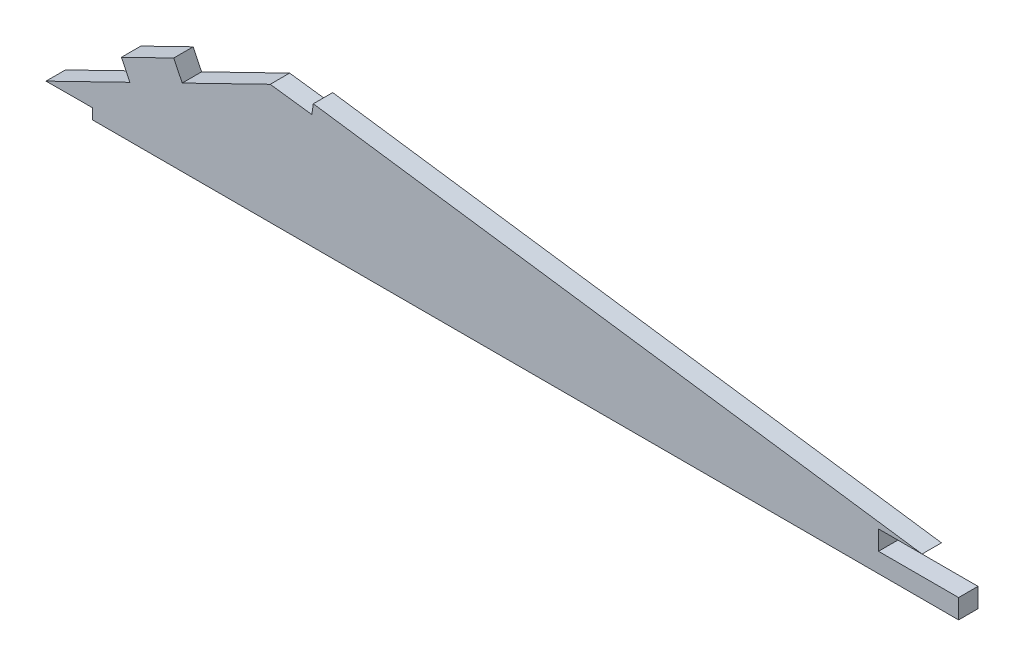
ISO-10303-21;
HEADER;
FILE_DESCRIPTION(('STEP AP214'),'2;1');
FILE_NAME('part.step','',(''),(''),'','','');
FILE_SCHEMA(('AUTOMOTIVE_DESIGN { 1 0 10303 214 1 1 1 1 }'));
ENDSEC;
DATA;
#1=APPLICATION_CONTEXT('core data for automotive mechanical design processes');
#2=APPLICATION_PROTOCOL_DEFINITION('international standard','automotive_design',2000,#1);
#3=PRODUCT_CONTEXT('',#1,'mechanical');
#4=PRODUCT('Part','Part','',(#3));
#5=PRODUCT_RELATED_PRODUCT_CATEGORY('part','',(#4));
#6=PRODUCT_DEFINITION_FORMATION('','',#4);
#7=PRODUCT_DEFINITION_CONTEXT('part definition',#1,'design');
#8=PRODUCT_DEFINITION('design','',#6,#7);
#9=PRODUCT_DEFINITION_SHAPE('','',#8);
#10=(LENGTH_UNIT() NAMED_UNIT(*) SI_UNIT(.MILLI.,.METRE.));
#11=(NAMED_UNIT(*) PLANE_ANGLE_UNIT() SI_UNIT($,.RADIAN.));
#12=(NAMED_UNIT(*) SI_UNIT($,.STERADIAN.) SOLID_ANGLE_UNIT());
#13=UNCERTAINTY_MEASURE_WITH_UNIT(LENGTH_MEASURE(1.E-05),#10,'distance_accuracy_value','');
#14=(GEOMETRIC_REPRESENTATION_CONTEXT(3) GLOBAL_UNCERTAINTY_ASSIGNED_CONTEXT((#13)) GLOBAL_UNIT_ASSIGNED_CONTEXT((#10,
#11,#12)) REPRESENTATION_CONTEXT('',''));
#15=CARTESIAN_POINT('',(0.,0.,0.));
#16=DIRECTION('',(0.,0.,1.));
#17=DIRECTION('',(1.,0.,0.));
#18=AXIS2_PLACEMENT_3D('',#15,#16,#17);
#19=CARTESIAN_POINT('',(10.8739383878739,9.30096898102377,2.));
#20=DIRECTION('',(0.438371146789072,-0.89879404629917,0.));
#21=DIRECTION('',(0.89879404629917,0.438371146789072,0.));
#22=AXIS2_PLACEMENT_3D('',#19,#20,#21);
#23=PLANE('',#22);
#24=DIRECTION('',(-0.898794046299169,-0.438371146789072,0.));
#25=VECTOR('',#24,1.);
#26=CARTESIAN_POINT('',(10.8739383878739,9.30096898102377,0.));
#27=LINE('',#26,#25);
#28=CARTESIAN_POINT('',(10.8739383878739,9.30096898102377,0.));
#29=VERTEX_POINT('',#28);
#30=CARTESIAN_POINT('',(2.2239444862891,5.08208506432496,0.));
#31=VERTEX_POINT('',#30);
#32=EDGE_CURVE('E172',#29,#31,#27,.T.);
#33=ORIENTED_EDGE('',*,*,#32,.T.);
#34=DIRECTION('',(0.,0.,-1.));
#35=VECTOR('',#34,1.);
#36=CARTESIAN_POINT('',(2.2239444862891,5.08208506432496,2.));
#37=LINE('',#36,#35);
#38=CARTESIAN_POINT('',(2.2239444862891,5.08208506432496,2.));
#39=VERTEX_POINT('',#38);
#40=EDGE_CURVE('E11',#39,#31,#37,.T.);
#41=ORIENTED_EDGE('',*,*,#40,.F.);
#42=DIRECTION('',(-0.898794046299169,-0.438371146789072,0.));
#43=VECTOR('',#42,1.);
#44=CARTESIAN_POINT('',(10.8739383878739,9.30096898102377,2.));
#45=LINE('',#44,#43);
#46=CARTESIAN_POINT('',(10.8739383878739,9.30096898102377,2.));
#47=VERTEX_POINT('',#46);
#48=EDGE_CURVE('E200',#47,#39,#45,.T.);
#49=ORIENTED_EDGE('',*,*,#48,.F.);
#50=DIRECTION('',(0.,0.,-1.));
#51=VECTOR('',#50,1.);
#52=CARTESIAN_POINT('',(10.8739383878739,9.30096898102377,2.));
#53=LINE('',#52,#51);
#54=EDGE_CURVE('E168',#47,#29,#53,.T.);
#55=ORIENTED_EDGE('',*,*,#54,.T.);
#56=EDGE_LOOP('',(#33,#41,#49,#55));
#57=FACE_BOUND('',#56,.T.);
#58=ADVANCED_FACE('F34',(#57),#23,.F.);
#59=CARTESIAN_POINT('',(7.00541028453807,5.10064133549443,2.));
#60=DIRECTION('',(-0.00388084579378902,0.999992469489608,0.));
#61=DIRECTION('',(-0.999992469489608,-0.00388084579378902,0.));
#62=AXIS2_PLACEMENT_3D('',#59,#60,#61);
#63=PLANE('',#62);
#64=DIRECTION('',(0.999992469489608,0.00388084579378902,0.));
#65=VECTOR('',#64,1.);
#66=CARTESIAN_POINT('',(7.00541028453807,5.10064133549443,0.));
#67=LINE('',#66,#65);
#68=CARTESIAN_POINT('',(7.00541028453807,5.10064133549443,0.));
#69=VERTEX_POINT('',#68);
#70=EDGE_CURVE('E175',#31,#69,#67,.T.);
#71=ORIENTED_EDGE('',*,*,#70,.T.);
#72=DIRECTION('',(0.,0.,-1.));
#73=VECTOR('',#72,1.);
#74=CARTESIAN_POINT('',(7.00541028453807,5.10064133549443,2.));
#75=LINE('',#74,#73);
#76=CARTESIAN_POINT('',(7.00541028453807,5.10064133549443,2.));
#77=VERTEX_POINT('',#76);
#78=EDGE_CURVE('E42',#77,#69,#75,.T.);
#79=ORIENTED_EDGE('',*,*,#78,.F.);
#80=DIRECTION('',(0.999992469489608,0.00388084579378902,0.));
#81=VECTOR('',#80,1.);
#82=CARTESIAN_POINT('',(7.00541028453807,5.10064133549443,2.));
#83=LINE('',#82,#81);
#84=EDGE_CURVE('E114',#39,#77,#83,.T.);
#85=ORIENTED_EDGE('',*,*,#84,.F.);
#86=ORIENTED_EDGE('',*,*,#40,.T.);
#87=EDGE_LOOP('',(#71,#79,#85,#86));
#88=FACE_BOUND('',#87,.T.);
#89=ADVANCED_FACE('F293',(#88),#63,.F.);
#90=CARTESIAN_POINT('',(7.00961390900483,4.01747724267128,2.));
#91=DIRECTION('',(0.999992469489616,0.00388084579166572,0.));
#92=DIRECTION('',(-0.00388084579166572,0.999992469489616,0.));
#93=AXIS2_PLACEMENT_3D('',#90,#91,#92);
#94=PLANE('',#93);
#95=DIRECTION('',(0.00388084579166572,-0.999992469489616,0.));
#96=VECTOR('',#95,1.);
#97=CARTESIAN_POINT('',(7.00961390900483,4.01747724267128,0.));
#98=LINE('',#97,#96);
#99=CARTESIAN_POINT('',(7.00961390900483,4.01747724267128,0.));
#100=VERTEX_POINT('',#99);
#101=EDGE_CURVE('E177',#69,#100,#98,.T.);
#102=ORIENTED_EDGE('',*,*,#101,.T.);
#103=DIRECTION('',(0.,0.,-1.));
#104=VECTOR('',#103,1.);
#105=CARTESIAN_POINT('',(7.00961390900483,4.01747724267128,2.));
#106=LINE('',#105,#104);
#107=CARTESIAN_POINT('',(7.00961390900483,4.01747724267128,2.));
#108=VERTEX_POINT('',#107);
#109=EDGE_CURVE('E228',#108,#100,#106,.T.);
#110=ORIENTED_EDGE('',*,*,#109,.F.);
#111=DIRECTION('',(0.00388084579166572,-0.999992469489616,0.));
#112=VECTOR('',#111,1.);
#113=CARTESIAN_POINT('',(7.00961390900483,4.01747724267128,2.));
#114=LINE('',#113,#112);
#115=EDGE_CURVE('E236',#77,#108,#114,.T.);
#116=ORIENTED_EDGE('',*,*,#115,.F.);
#117=ORIENTED_EDGE('',*,*,#78,.T.);
#118=EDGE_LOOP('',(#102,#110,#116,#117));
#119=FACE_BOUND('',#118,.T.);
#120=ADVANCED_FACE('F234',(#119),#94,.F.);
#121=CARTESIAN_POINT('',(7.00961390900483,4.01747724267128,2.));
#122=DIRECTION('',(0.,1.,0.));
#123=DIRECTION('',(0.,0.,1.));
#124=AXIS2_PLACEMENT_3D('',#121,#122,#123);
#125=PLANE('',#124);
#126=DIRECTION('',(1.,0.,0.));
#127=VECTOR('',#126,1.);
#128=CARTESIAN_POINT('',(7.00961390900483,4.01747724267128,0.));
#129=LINE('',#128,#127);
#130=CARTESIAN_POINT('',(96.2983160361384,4.01747724267128,0.));
#131=VERTEX_POINT('',#130);
#132=EDGE_CURVE('E179',#100,#131,#129,.T.);
#133=ORIENTED_EDGE('',*,*,#132,.T.);
#134=DIRECTION('',(0.,0.,-1.));
#135=VECTOR('',#134,1.);
#136=CARTESIAN_POINT('',(96.2983160361384,4.01747724267128,2.));
#137=LINE('',#136,#135);
#138=CARTESIAN_POINT('',(96.2983160361384,4.01747724267128,2.));
#139=VERTEX_POINT('',#138);
#140=EDGE_CURVE('E225',#139,#131,#137,.T.);
#141=ORIENTED_EDGE('',*,*,#140,.F.);
#142=DIRECTION('',(1.,0.,0.));
#143=VECTOR('',#142,1.);
#144=CARTESIAN_POINT('',(7.00961390900483,4.01747724267128,2.));
#145=LINE('',#144,#143);
#146=EDGE_CURVE('E254',#108,#139,#145,.T.);
#147=ORIENTED_EDGE('',*,*,#146,.F.);
#148=ORIENTED_EDGE('',*,*,#109,.T.);
#149=EDGE_LOOP('',(#133,#141,#147,#148));
#150=FACE_BOUND('',#149,.T.);
#151=ADVANCED_FACE('F245',(#150),#125,.F.);
#152=CARTESIAN_POINT('',(96.2983160361384,4.01747724267128,2.));
#153=DIRECTION('',(-1.,0.,0.));
#154=DIRECTION('',(0.,0.,1.));
#155=AXIS2_PLACEMENT_3D('',#152,#153,#154);
#156=PLANE('',#155);
#157=DIRECTION('',(0.,1.,0.));
#158=VECTOR('',#157,1.);
#159=CARTESIAN_POINT('',(96.2983160361384,4.01747724267128,0.));
#160=LINE('',#159,#158);
#161=CARTESIAN_POINT('',(96.2983160361384,6.01747724267128,0.));
#162=VERTEX_POINT('',#161);
#163=EDGE_CURVE('E181',#131,#162,#160,.T.);
#164=ORIENTED_EDGE('',*,*,#163,.T.);
#165=DIRECTION('',(0.,0.,-1.));
#166=VECTOR('',#165,1.);
#167=CARTESIAN_POINT('',(96.2983160361384,6.01747724267128,2.));
#168=LINE('',#167,#166);
#169=CARTESIAN_POINT('',(96.2983160361384,6.01747724267128,2.));
#170=VERTEX_POINT('',#169);
#171=EDGE_CURVE('E222',#170,#162,#168,.T.);
#172=ORIENTED_EDGE('',*,*,#171,.F.);
#173=DIRECTION('',(0.,1.,0.));
#174=VECTOR('',#173,1.);
#175=CARTESIAN_POINT('',(96.2983160361384,4.01747724267128,2.));
#176=LINE('',#175,#174);
#177=EDGE_CURVE('E251',#139,#170,#176,.T.);
#178=ORIENTED_EDGE('',*,*,#177,.F.);
#179=ORIENTED_EDGE('',*,*,#140,.T.);
#180=EDGE_LOOP('',(#164,#172,#178,#179));
#181=FACE_BOUND('',#180,.T.);
#182=ADVANCED_FACE('F249',(#181),#156,.F.);
#183=CARTESIAN_POINT('',(88.0421396401572,6.01747724267128,2.));
#184=DIRECTION('',(0.,-1.,0.));
#185=DIRECTION('',(0.,0.,-1.));
#186=AXIS2_PLACEMENT_3D('',#183,#184,#185);
#187=PLANE('',#186);
#188=DIRECTION('',(-1.,0.,0.));
#189=VECTOR('',#188,1.);
#190=CARTESIAN_POINT('',(88.0421396401572,6.01747724267128,0.));
#191=LINE('',#190,#189);
#192=CARTESIAN_POINT('',(88.0421396401572,6.01747724267128,0.));
#193=VERTEX_POINT('',#192);
#194=EDGE_CURVE('E183',#162,#193,#191,.T.);
#195=ORIENTED_EDGE('',*,*,#194,.T.);
#196=DIRECTION('',(0.,0.,-1.));
#197=VECTOR('',#196,1.);
#198=CARTESIAN_POINT('',(88.0421396401572,6.01747724267128,2.));
#199=LINE('',#198,#197);
#200=CARTESIAN_POINT('',(88.0421396401572,6.01747724267128,2.));
#201=VERTEX_POINT('',#200);
#202=EDGE_CURVE('E219',#201,#193,#199,.T.);
#203=ORIENTED_EDGE('',*,*,#202,.F.);
#204=DIRECTION('',(-1.,0.,0.));
#205=VECTOR('',#204,1.);
#206=CARTESIAN_POINT('',(88.0421396401572,6.01747724267128,2.));
#207=LINE('',#206,#205);
#208=EDGE_CURVE('E253',#170,#201,#207,.T.);
#209=ORIENTED_EDGE('',*,*,#208,.F.);
#210=ORIENTED_EDGE('',*,*,#171,.T.);
#211=EDGE_LOOP('',(#195,#203,#209,#210));
#212=FACE_BOUND('',#211,.T.);
#213=ADVANCED_FACE('F306',(#212),#187,.F.);
#214=CARTESIAN_POINT('',(88.0421396401572,6.01747724267128,2.));
#215=DIRECTION('',(-1.,-4.57966997657877E-13,0.));
#216=DIRECTION('',(4.57966997657877E-13,-1.,0.));
#217=AXIS2_PLACEMENT_3D('',#214,#215,#216);
#218=PLANE('',#217);
#219=DIRECTION('',(-4.57966997657877E-13,1.,0.));
#220=VECTOR('',#219,1.);
#221=CARTESIAN_POINT('',(88.0421396401572,6.01747724267128,0.));
#222=LINE('',#221,#220);
#223=CARTESIAN_POINT('',(88.0421396401563,8.01747724267128,0.));
#224=VERTEX_POINT('',#223);
#225=EDGE_CURVE('E185',#193,#224,#222,.T.);
#226=ORIENTED_EDGE('',*,*,#225,.T.);
#227=DIRECTION('',(0.,0.,-1.));
#228=VECTOR('',#227,1.);
#229=CARTESIAN_POINT('',(88.0421396401563,8.01747724267128,2.));
#230=LINE('',#229,#228);
#231=CARTESIAN_POINT('',(88.0421396401563,8.01747724267128,2.));
#232=VERTEX_POINT('',#231);
#233=EDGE_CURVE('E216',#232,#224,#230,.T.);
#234=ORIENTED_EDGE('',*,*,#233,.F.);
#235=DIRECTION('',(-4.57966997657877E-13,1.,0.));
#236=VECTOR('',#235,1.);
#237=CARTESIAN_POINT('',(88.0421396401572,6.01747724267128,2.));
#238=LINE('',#237,#236);
#239=EDGE_CURVE('E256',#201,#232,#238,.T.);
#240=ORIENTED_EDGE('',*,*,#239,.F.);
#241=ORIENTED_EDGE('',*,*,#202,.T.);
#242=EDGE_LOOP('',(#226,#234,#240,#241));
#243=FACE_BOUND('',#242,.T.);
#244=ADVANCED_FACE('F309',(#243),#218,.F.);
#245=CARTESIAN_POINT('',(88.0421396401563,8.01747724267128,2.));
#246=DIRECTION('',(0.,1.,0.));
#247=DIRECTION('',(0.,0.,1.));
#248=AXIS2_PLACEMENT_3D('',#245,#246,#247);
#249=PLANE('',#248);
#250=DIRECTION('',(1.,0.,0.));
#251=VECTOR('',#250,1.);
#252=CARTESIAN_POINT('',(88.0421396401563,8.01747724267128,0.));
#253=LINE('',#252,#251);
#254=CARTESIAN_POINT('',(92.5317577549287,8.01747724267128,0.));
#255=VERTEX_POINT('',#254);
#256=EDGE_CURVE('E187',#224,#255,#253,.T.);
#257=ORIENTED_EDGE('',*,*,#256,.T.);
#258=DIRECTION('',(0.,0.,-1.));
#259=VECTOR('',#258,1.);
#260=CARTESIAN_POINT('',(92.5317577549287,8.01747724267128,2.));
#261=LINE('',#260,#259);
#262=CARTESIAN_POINT('',(92.5317577549287,8.01747724267128,2.));
#263=VERTEX_POINT('',#262);
#264=EDGE_CURVE('E213',#263,#255,#261,.T.);
#265=ORIENTED_EDGE('',*,*,#264,.F.);
#266=DIRECTION('',(1.,0.,0.));
#267=VECTOR('',#266,1.);
#268=CARTESIAN_POINT('',(88.0421396401563,8.01747724267128,2.));
#269=LINE('',#268,#267);
#270=EDGE_CURVE('E262',#232,#263,#269,.T.);
#271=ORIENTED_EDGE('',*,*,#270,.F.);
#272=ORIENTED_EDGE('',*,*,#233,.T.);
#273=EDGE_LOOP('',(#257,#265,#271,#272));
#274=FACE_BOUND('',#273,.T.);
#275=ADVANCED_FACE('F313',(#274),#249,.F.);
#276=CARTESIAN_POINT('',(29.7785199666234,16.8368696617186,2.));
#277=DIRECTION('',(-0.139173100960084,-0.990268068741568,0.));
#278=DIRECTION('',(0.990268068741568,-0.139173100960084,0.));
#279=AXIS2_PLACEMENT_3D('',#276,#277,#278);
#280=PLANE('',#279);
#281=DIRECTION('',(-0.990268068741568,0.139173100960084,0.));
#282=VECTOR('',#281,1.);
#283=CARTESIAN_POINT('',(29.7785199666234,16.8368696617186,0.));
#284=LINE('',#283,#282);
#285=CARTESIAN_POINT('',(29.7785199666234,16.8368696617186,0.));
#286=VERTEX_POINT('',#285);
#287=EDGE_CURVE('E189',#255,#286,#284,.T.);
#288=ORIENTED_EDGE('',*,*,#287,.T.);
#289=DIRECTION('',(0.,0.,-1.));
#290=VECTOR('',#289,1.);
#291=CARTESIAN_POINT('',(29.7785199666234,16.8368696617186,2.));
#292=LINE('',#291,#290);
#293=CARTESIAN_POINT('',(29.7785199666234,16.8368696617186,2.));
#294=VERTEX_POINT('',#293);
#295=EDGE_CURVE('E210',#294,#286,#292,.T.);
#296=ORIENTED_EDGE('',*,*,#295,.F.);
#297=DIRECTION('',(-0.990268068741568,0.139173100960084,0.));
#298=VECTOR('',#297,1.);
#299=CARTESIAN_POINT('',(29.7785199666234,16.8368696617186,2.));
#300=LINE('',#299,#298);
#301=EDGE_CURVE('E264',#263,#294,#300,.T.);
#302=ORIENTED_EDGE('',*,*,#301,.F.);
#303=ORIENTED_EDGE('',*,*,#264,.T.);
#304=EDGE_LOOP('',(#288,#296,#302,#303));
#305=FACE_BOUND('',#304,.T.);
#306=ADVANCED_FACE('F317',(#305),#280,.F.);
#307=CARTESIAN_POINT('',(29.6303099138324,15.7991774042635,2.));
#308=DIRECTION('',(0.989953726819019,-0.141391720963904,0.));
#309=DIRECTION('',(0.141391720963904,0.989953726819019,0.));
#310=AXIS2_PLACEMENT_3D('',#307,#308,#309);
#311=PLANE('',#310);
#312=DIRECTION('',(-0.141391720963904,-0.989953726819019,0.));
#313=VECTOR('',#312,1.);
#314=CARTESIAN_POINT('',(29.6303099138324,15.7991774042635,0.));
#315=LINE('',#314,#313);
#316=CARTESIAN_POINT('',(29.6303099138324,15.7991774042635,0.));
#317=VERTEX_POINT('',#316);
#318=EDGE_CURVE('E191',#286,#317,#315,.T.);
#319=ORIENTED_EDGE('',*,*,#318,.T.);
#320=DIRECTION('',(0.,0.,-1.));
#321=VECTOR('',#320,1.);
#322=CARTESIAN_POINT('',(29.6303099138324,15.7991774042635,2.));
#323=LINE('',#322,#321);
#324=CARTESIAN_POINT('',(29.6303099138324,15.7991774042635,2.));
#325=VERTEX_POINT('',#324);
#326=EDGE_CURVE('E207',#325,#317,#323,.T.);
#327=ORIENTED_EDGE('',*,*,#326,.F.);
#328=DIRECTION('',(-0.141391720963904,-0.989953726819019,0.));
#329=VECTOR('',#328,1.);
#330=CARTESIAN_POINT('',(29.6303099138324,15.7991774042635,2.));
#331=LINE('',#330,#329);
#332=EDGE_CURVE('E266',#294,#325,#331,.T.);
#333=ORIENTED_EDGE('',*,*,#332,.F.);
#334=ORIENTED_EDGE('',*,*,#295,.T.);
#335=EDGE_LOOP('',(#319,#327,#333,#334));
#336=FACE_BOUND('',#335,.T.);
#337=ADVANCED_FACE('F321',(#336),#311,.F.);
#338=CARTESIAN_POINT('',(25.3360842904614,16.35462883831,2.));
#339=DIRECTION('',(-0.128279776916056,-0.991738019254262,0.));
#340=DIRECTION('',(0.991738019254262,-0.128279776916056,0.));
#341=AXIS2_PLACEMENT_3D('',#338,#339,#340);
#342=PLANE('',#341);
#343=DIRECTION('',(-0.991738019254262,0.128279776916056,0.));
#344=VECTOR('',#343,1.);
#345=CARTESIAN_POINT('',(25.3360842904614,16.35462883831,0.));
#346=LINE('',#345,#344);
#347=CARTESIAN_POINT('',(25.3360842904614,16.35462883831,0.));
#348=VERTEX_POINT('',#347);
#349=EDGE_CURVE('E193',#317,#348,#346,.T.);
#350=ORIENTED_EDGE('',*,*,#349,.T.);
#351=DIRECTION('',(0.,0.,-1.));
#352=VECTOR('',#351,1.);
#353=CARTESIAN_POINT('',(25.3360842904614,16.35462883831,2.));
#354=LINE('',#353,#352);
#355=CARTESIAN_POINT('',(25.3360842904614,16.35462883831,2.));
#356=VERTEX_POINT('',#355);
#357=EDGE_CURVE('E204',#356,#348,#354,.T.);
#358=ORIENTED_EDGE('',*,*,#357,.F.);
#359=DIRECTION('',(-0.991738019254262,0.128279776916056,0.));
#360=VECTOR('',#359,1.);
#361=CARTESIAN_POINT('',(25.3360842904614,16.35462883831,2.));
#362=LINE('',#361,#360);
#363=EDGE_CURVE('E268',#325,#356,#362,.T.);
#364=ORIENTED_EDGE('',*,*,#363,.F.);
#365=ORIENTED_EDGE('',*,*,#326,.T.);
#366=EDGE_LOOP('',(#350,#358,#364,#365));
#367=FACE_BOUND('',#366,.T.);
#368=ADVANCED_FACE('F274',(#367),#342,.F.);
#369=CARTESIAN_POINT('',(16.2667026656683,11.9311958617582,2.));
#370=DIRECTION('',(0.438371146789061,-0.898794046299175,0.));
#371=DIRECTION('',(0.898794046299175,0.438371146789061,0.));
#372=AXIS2_PLACEMENT_3D('',#369,#370,#371);
#373=PLANE('',#372);
#374=DIRECTION('',(-0.898794046299175,-0.438371146789061,0.));
#375=VECTOR('',#374,1.);
#376=CARTESIAN_POINT('',(16.2667026656683,11.9311958617582,0.));
#377=LINE('',#376,#375);
#378=CARTESIAN_POINT('',(16.2667026656683,11.9311958617582,0.));
#379=VERTEX_POINT('',#378);
#380=EDGE_CURVE('E195',#348,#379,#377,.T.);
#381=ORIENTED_EDGE('',*,*,#380,.T.);
#382=DIRECTION('',(0.,0.,-1.));
#383=VECTOR('',#382,1.);
#384=CARTESIAN_POINT('',(16.2667026656683,11.9311958617582,2.));
#385=LINE('',#384,#383);
#386=CARTESIAN_POINT('',(16.2667026656683,11.9311958617582,2.));
#387=VERTEX_POINT('',#386);
#388=EDGE_CURVE('E163',#387,#379,#385,.T.);
#389=ORIENTED_EDGE('',*,*,#388,.F.);
#390=DIRECTION('',(-0.898794046299175,-0.438371146789061,0.));
#391=VECTOR('',#390,1.);
#392=CARTESIAN_POINT('',(16.2667026656683,11.9311958617582,2.));
#393=LINE('',#392,#391);
#394=EDGE_CURVE('E154',#356,#387,#393,.T.);
#395=ORIENTED_EDGE('',*,*,#394,.F.);
#396=ORIENTED_EDGE('',*,*,#357,.T.);
#397=EDGE_LOOP('',(#381,#389,#395,#396));
#398=FACE_BOUND('',#397,.T.);
#399=ADVANCED_FACE('F278',(#398),#373,.F.);
#400=CARTESIAN_POINT('',(15.3899603720903,13.7287839543565,2.));
#401=DIRECTION('',(-0.898794046299195,-0.43837114678902,0.));
#402=DIRECTION('',(0.43837114678902,-0.898794046299195,0.));
#403=AXIS2_PLACEMENT_3D('',#400,#401,#402);
#404=PLANE('',#403);
#405=DIRECTION('',(-0.43837114678902,0.898794046299195,0.));
#406=VECTOR('',#405,1.);
#407=CARTESIAN_POINT('',(15.3899603720903,13.7287839543565,0.));
#408=LINE('',#407,#406);
#409=CARTESIAN_POINT('',(15.3899603720903,13.7287839543565,0.));
#410=VERTEX_POINT('',#409);
#411=EDGE_CURVE('E162',#379,#410,#408,.T.);
#412=ORIENTED_EDGE('',*,*,#411,.T.);
#413=DIRECTION('',(0.,0.,-1.));
#414=VECTOR('',#413,1.);
#415=CARTESIAN_POINT('',(15.3899603720903,13.7287839543565,2.));
#416=LINE('',#415,#414);
#417=CARTESIAN_POINT('',(15.3899603720903,13.7287839543565,2.));
#418=VERTEX_POINT('',#417);
#419=EDGE_CURVE('E159',#418,#410,#416,.T.);
#420=ORIENTED_EDGE('',*,*,#419,.F.);
#421=DIRECTION('',(-0.43837114678902,0.898794046299195,0.));
#422=VECTOR('',#421,1.);
#423=CARTESIAN_POINT('',(15.3899603720903,13.7287839543565,2.));
#424=LINE('',#423,#422);
#425=EDGE_CURVE('E148',#387,#418,#424,.T.);
#426=ORIENTED_EDGE('',*,*,#425,.F.);
#427=ORIENTED_EDGE('',*,*,#388,.T.);
#428=EDGE_LOOP('',(#412,#420,#426,#427));
#429=FACE_BOUND('',#428,.T.);
#430=ADVANCED_FACE('F160',(#429),#404,.F.);
#431=CARTESIAN_POINT('',(9.99719609429593,11.0985570736225,2.));
#432=DIRECTION('',(0.43837114678905,-0.89879404629918,0.));
#433=DIRECTION('',(0.89879404629918,0.43837114678905,0.));
#434=AXIS2_PLACEMENT_3D('',#431,#432,#433);
#435=PLANE('',#434);
#436=DIRECTION('',(-0.89879404629918,-0.43837114678905,0.));
#437=VECTOR('',#436,1.);
#438=CARTESIAN_POINT('',(9.99719609429593,11.0985570736225,0.));
#439=LINE('',#438,#437);
#440=CARTESIAN_POINT('',(9.99719609429593,11.0985570736225,0.));
#441=VERTEX_POINT('',#440);
#442=EDGE_CURVE('E100',#410,#441,#439,.T.);
#443=ORIENTED_EDGE('',*,*,#442,.T.);
#444=DIRECTION('',(0.,0.,-1.));
#445=VECTOR('',#444,1.);
#446=CARTESIAN_POINT('',(9.99719609429593,11.0985570736225,2.));
#447=LINE('',#446,#445);
#448=CARTESIAN_POINT('',(9.99719609429593,11.0985570736225,2.));
#449=VERTEX_POINT('',#448);
#450=EDGE_CURVE('E164',#449,#441,#447,.T.);
#451=ORIENTED_EDGE('',*,*,#450,.F.);
#452=DIRECTION('',(-0.89879404629918,-0.43837114678905,0.));
#453=VECTOR('',#452,1.);
#454=CARTESIAN_POINT('',(9.99719609429593,11.0985570736225,2.));
#455=LINE('',#454,#453);
#456=EDGE_CURVE('E152',#418,#449,#455,.T.);
#457=ORIENTED_EDGE('',*,*,#456,.F.);
#458=ORIENTED_EDGE('',*,*,#419,.T.);
#459=EDGE_LOOP('',(#443,#451,#457,#458));
#460=FACE_BOUND('',#459,.T.);
#461=ADVANCED_FACE('F166',(#460),#435,.F.);
#462=CARTESIAN_POINT('',(10.8739383878739,9.30096898102377,2.));
#463=DIRECTION('',(0.898794046299239,0.43837114678893,0.));
#464=DIRECTION('',(-0.43837114678893,0.898794046299239,0.));
#465=AXIS2_PLACEMENT_3D('',#462,#463,#464);
#466=PLANE('',#465);
#467=DIRECTION('',(0.43837114678893,-0.898794046299239,0.));
#468=VECTOR('',#467,1.);
#469=CARTESIAN_POINT('',(10.8739383878739,9.30096898102377,0.));
#470=LINE('',#469,#468);
#471=EDGE_CURVE('E106',#441,#29,#470,.T.);
#472=ORIENTED_EDGE('',*,*,#471,.T.);
#473=ORIENTED_EDGE('',*,*,#54,.F.);
#474=DIRECTION('',(0.43837114678893,-0.898794046299239,0.));
#475=VECTOR('',#474,1.);
#476=CARTESIAN_POINT('',(10.8739383878739,9.30096898102377,2.));
#477=LINE('',#476,#475);
#478=EDGE_CURVE('E50',#449,#47,#477,.T.);
#479=ORIENTED_EDGE('',*,*,#478,.F.);
#480=ORIENTED_EDGE('',*,*,#450,.T.);
#481=EDGE_LOOP('',(#472,#473,#479,#480));
#482=FACE_BOUND('',#481,.T.);
#483=ADVANCED_FACE('F282',(#482),#466,.F.);
#484=CARTESIAN_POINT('',(0.,0.,2.));
#485=DIRECTION('',(0.,0.,1.));
#486=DIRECTION('',(1.,0.,0.));
#487=AXIS2_PLACEMENT_3D('',#484,#485,#486);
#488=PLANE('',#487);
#489=ORIENTED_EDGE('',*,*,#48,.T.);
#490=ORIENTED_EDGE('',*,*,#84,.T.);
#491=ORIENTED_EDGE('',*,*,#115,.T.);
#492=ORIENTED_EDGE('',*,*,#146,.T.);
#493=ORIENTED_EDGE('',*,*,#177,.T.);
#494=ORIENTED_EDGE('',*,*,#208,.T.);
#495=ORIENTED_EDGE('',*,*,#239,.T.);
#496=ORIENTED_EDGE('',*,*,#270,.T.);
#497=ORIENTED_EDGE('',*,*,#301,.T.);
#498=ORIENTED_EDGE('',*,*,#332,.T.);
#499=ORIENTED_EDGE('',*,*,#363,.T.);
#500=ORIENTED_EDGE('',*,*,#394,.T.);
#501=ORIENTED_EDGE('',*,*,#425,.T.);
#502=ORIENTED_EDGE('',*,*,#456,.T.);
#503=ORIENTED_EDGE('',*,*,#478,.T.);
#504=EDGE_LOOP('',(#489,#490,#491,#492,#493,#494,#495,#496,#497,#498,#499,#500,#501,#502,#503));
#505=FACE_BOUND('',#504,.T.);
#506=ADVANCED_FACE('F150',(#505),#488,.T.);
#507=CARTESIAN_POINT('',(0.,0.,0.));
#508=DIRECTION('',(0.,0.,1.));
#509=DIRECTION('',(1.,0.,0.));
#510=AXIS2_PLACEMENT_3D('',#507,#508,#509);
#511=PLANE('',#510);
#512=ORIENTED_EDGE('',*,*,#32,.F.);
#513=ORIENTED_EDGE('',*,*,#471,.F.);
#514=ORIENTED_EDGE('',*,*,#442,.F.);
#515=ORIENTED_EDGE('',*,*,#411,.F.);
#516=ORIENTED_EDGE('',*,*,#380,.F.);
#517=ORIENTED_EDGE('',*,*,#349,.F.);
#518=ORIENTED_EDGE('',*,*,#318,.F.);
#519=ORIENTED_EDGE('',*,*,#287,.F.);
#520=ORIENTED_EDGE('',*,*,#256,.F.);
#521=ORIENTED_EDGE('',*,*,#225,.F.);
#522=ORIENTED_EDGE('',*,*,#194,.F.);
#523=ORIENTED_EDGE('',*,*,#163,.F.);
#524=ORIENTED_EDGE('',*,*,#132,.F.);
#525=ORIENTED_EDGE('',*,*,#101,.F.);
#526=ORIENTED_EDGE('',*,*,#70,.F.);
#527=EDGE_LOOP('',(#512,#513,#514,#515,#516,#517,#518,#519,#520,#521,#522,#523,#524,#525,#526));
#528=FACE_BOUND('',#527,.T.);
#529=ADVANCED_FACE('F240',(#528),#511,.F.);
#530=CLOSED_SHELL('',(#58,#89,#120,#151,#182,#213,#244,#275,#306,#337,#368,#399,#430,#461,#483,
#506,#529));
#531=MANIFOLD_SOLID_BREP('B2',#530);
#532=ADVANCED_BREP_SHAPE_REPRESENTATION('',(#18,#531),#14);
#533=SHAPE_DEFINITION_REPRESENTATION(#9,#532);
ENDSEC;
END-ISO-10303-21;
